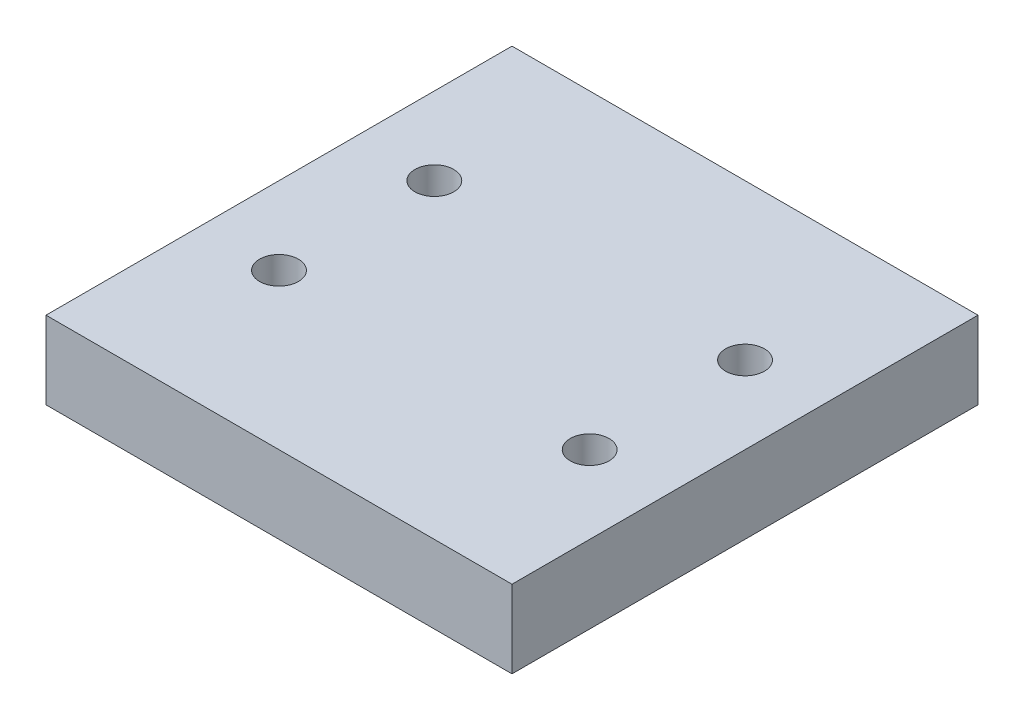
ISO-10303-21;
HEADER;
FILE_DESCRIPTION(('STEP AP214'),'2;1');
FILE_NAME('part.step','',(''),(''),'','','');
FILE_SCHEMA(('AUTOMOTIVE_DESIGN { 1 0 10303 214 1 1 1 1 }'));
ENDSEC;
DATA;
#1=APPLICATION_CONTEXT('core data for automotive mechanical design processes');
#2=APPLICATION_PROTOCOL_DEFINITION('international standard','automotive_design',2000,#1);
#3=PRODUCT_CONTEXT('',#1,'mechanical');
#4=PRODUCT('Part','Part','',(#3));
#5=PRODUCT_RELATED_PRODUCT_CATEGORY('part','',(#4));
#6=PRODUCT_DEFINITION_FORMATION('','',#4);
#7=PRODUCT_DEFINITION_CONTEXT('part definition',#1,'design');
#8=PRODUCT_DEFINITION('design','',#6,#7);
#9=PRODUCT_DEFINITION_SHAPE('','',#8);
#10=(LENGTH_UNIT() NAMED_UNIT(*) SI_UNIT(.MILLI.,.METRE.));
#11=(NAMED_UNIT(*) PLANE_ANGLE_UNIT() SI_UNIT($,.RADIAN.));
#12=(NAMED_UNIT(*) SI_UNIT($,.STERADIAN.) SOLID_ANGLE_UNIT());
#13=UNCERTAINTY_MEASURE_WITH_UNIT(LENGTH_MEASURE(1.E-05),#10,'distance_accuracy_value','');
#14=(GEOMETRIC_REPRESENTATION_CONTEXT(3) GLOBAL_UNCERTAINTY_ASSIGNED_CONTEXT((#13)) GLOBAL_UNIT_ASSIGNED_CONTEXT((#10,
#11,#12)) REPRESENTATION_CONTEXT('',''));
#15=CARTESIAN_POINT('',(0.,0.,0.));
#16=DIRECTION('',(0.,0.,1.));
#17=DIRECTION('',(1.,0.,0.));
#18=AXIS2_PLACEMENT_3D('',#15,#16,#17);
#19=CARTESIAN_POINT('',(-479.999999999999,30.,-1193.6));
#20=DIRECTION('',(0.,1.,0.));
#21=DIRECTION('',(0.,0.,1.));
#22=AXIS2_PLACEMENT_3D('',#19,#20,#21);
#23=PLANE('',#22);
#24=CARTESIAN_POINT('',(-489.999999999999,30.,-1180.));
#25=DIRECTION('',(0.,1.,0.));
#26=DIRECTION('',(0.,0.,1.));
#27=AXIS2_PLACEMENT_3D('',#24,#25,#26);
#28=CIRCLE('',#27,2.49999999999995);
#29=CARTESIAN_POINT('',(-489.999999999999,30.,-1177.5));
#30=VERTEX_POINT('',#29);
#31=EDGE_CURVE('E274',#30,#30,#28,.F.);
#32=ORIENTED_EDGE('',*,*,#31,.F.);
#33=EDGE_LOOP('',(#32));
#34=FACE_BOUND('',#33,.T.);
#35=CARTESIAN_POINT('',(-529.999999999999,30.,-1160.));
#36=DIRECTION('',(0.,1.,0.));
#37=DIRECTION('',(0.,0.,1.));
#38=AXIS2_PLACEMENT_3D('',#35,#36,#37);
#39=CIRCLE('',#38,2.49999999999995);
#40=CARTESIAN_POINT('',(-529.999999999999,30.,-1157.5));
#41=VERTEX_POINT('',#40);
#42=EDGE_CURVE('E74',#41,#41,#39,.F.);
#43=ORIENTED_EDGE('',*,*,#42,.F.);
#44=EDGE_LOOP('',(#43));
#45=FACE_BOUND('',#44,.T.);
#46=DIRECTION('',(0.,0.,1.));
#47=VECTOR('',#46,1.);
#48=CARTESIAN_POINT('',(-539.999999999999,30.,0.));
#49=LINE('',#48,#47);
#50=CARTESIAN_POINT('',(-539.999999999999,30.,-1200.));
#51=VERTEX_POINT('',#50);
#52=CARTESIAN_POINT('',(-539.999999999999,30.,-1140.));
#53=VERTEX_POINT('',#52);
#54=EDGE_CURVE('E19',#51,#53,#49,.T.);
#55=ORIENTED_EDGE('',*,*,#54,.F.);
#56=DIRECTION('',(1.,0.,0.));
#57=VECTOR('',#56,1.);
#58=CARTESIAN_POINT('',(0.,30.,-1200.));
#59=LINE('',#58,#57);
#60=CARTESIAN_POINT('',(-479.999999999999,30.,-1200.));
#61=VERTEX_POINT('',#60);
#62=EDGE_CURVE('E56',#61,#51,#59,.F.);
#63=ORIENTED_EDGE('',*,*,#62,.F.);
#64=DIRECTION('',(0.,0.,1.));
#65=VECTOR('',#64,1.);
#66=CARTESIAN_POINT('',(-479.999999999999,30.,0.));
#67=LINE('',#66,#65);
#68=CARTESIAN_POINT('',(-479.999999999999,30.,-1140.));
#69=VERTEX_POINT('',#68);
#70=EDGE_CURVE('E73',#69,#61,#67,.F.);
#71=ORIENTED_EDGE('',*,*,#70,.F.);
#72=DIRECTION('',(1.,0.,0.));
#73=VECTOR('',#72,1.);
#74=CARTESIAN_POINT('',(0.,30.,-1140.));
#75=LINE('',#74,#73);
#76=EDGE_CURVE('E57',#53,#69,#75,.T.);
#77=ORIENTED_EDGE('',*,*,#76,.F.);
#78=EDGE_LOOP('',(#55,#63,#71,#77));
#79=FACE_BOUND('',#78,.T.);
#80=CARTESIAN_POINT('',(-529.999999999999,30.,-1180.));
#81=DIRECTION('',(0.,1.,0.));
#82=DIRECTION('',(0.,0.,1.));
#83=AXIS2_PLACEMENT_3D('',#80,#81,#82);
#84=CIRCLE('',#83,2.49999999999995);
#85=CARTESIAN_POINT('',(-529.999999999999,30.,-1177.5));
#86=VERTEX_POINT('',#85);
#87=EDGE_CURVE('E277',#86,#86,#84,.F.);
#88=ORIENTED_EDGE('',*,*,#87,.F.);
#89=EDGE_LOOP('',(#88));
#90=FACE_BOUND('',#89,.T.);
#91=CARTESIAN_POINT('',(-489.999999999999,30.,-1160.));
#92=DIRECTION('',(0.,1.,0.));
#93=DIRECTION('',(0.,0.,1.));
#94=AXIS2_PLACEMENT_3D('',#91,#92,#93);
#95=CIRCLE('',#94,2.49999999999995);
#96=CARTESIAN_POINT('',(-489.999999999999,30.,-1157.5));
#97=VERTEX_POINT('',#96);
#98=EDGE_CURVE('E272',#97,#97,#95,.F.);
#99=ORIENTED_EDGE('',*,*,#98,.F.);
#100=EDGE_LOOP('',(#99));
#101=FACE_BOUND('',#100,.T.);
#102=ADVANCED_FACE('F16',(#34,#45,#79,#90,#101),#23,.F.);
#103=CARTESIAN_POINT('',(-539.999999999999,40.,-1200.));
#104=DIRECTION('',(0.,0.,1.));
#105=DIRECTION('',(1.,0.,0.));
#106=AXIS2_PLACEMENT_3D('',#103,#104,#105);
#107=PLANE('',#106);
#108=DIRECTION('',(0.,1.,0.));
#109=VECTOR('',#108,1.);
#110=CARTESIAN_POINT('',(-539.999999999999,40.,-1200.));
#111=LINE('',#110,#109);
#112=CARTESIAN_POINT('',(-539.999999999999,40.,-1200.));
#113=VERTEX_POINT('',#112);
#114=EDGE_CURVE('E68',#51,#113,#111,.T.);
#115=ORIENTED_EDGE('',*,*,#114,.T.);
#116=DIRECTION('',(1.,0.,0.));
#117=VECTOR('',#116,1.);
#118=CARTESIAN_POINT('',(-539.999999999999,40.,-1200.));
#119=LINE('',#118,#117);
#120=CARTESIAN_POINT('',(-479.999999999999,40.,-1200.));
#121=VERTEX_POINT('',#120);
#122=EDGE_CURVE('E26',#121,#113,#119,.F.);
#123=ORIENTED_EDGE('',*,*,#122,.F.);
#124=DIRECTION('',(0.,1.,0.));
#125=VECTOR('',#124,1.);
#126=CARTESIAN_POINT('',(-479.999999999999,40.,-1200.));
#127=LINE('',#126,#125);
#128=EDGE_CURVE('E71',#121,#61,#127,.F.);
#129=ORIENTED_EDGE('',*,*,#128,.T.);
#130=ORIENTED_EDGE('',*,*,#62,.T.);
#131=EDGE_LOOP('',(#115,#123,#129,#130));
#132=FACE_BOUND('',#131,.T.);
#133=ADVANCED_FACE('F66',(#132),#107,.F.);
#134=CARTESIAN_POINT('',(0.,40.,0.));
#135=DIRECTION('',(0.,1.,0.));
#136=DIRECTION('',(0.,0.,1.));
#137=AXIS2_PLACEMENT_3D('',#134,#135,#136);
#138=PLANE('',#137);
#139=DIRECTION('',(0.,0.,1.));
#140=VECTOR('',#139,1.);
#141=CARTESIAN_POINT('',(-479.999999999999,40.,-1140.));
#142=LINE('',#141,#140);
#143=CARTESIAN_POINT('',(-479.999999999999,40.,-1140.));
#144=VERTEX_POINT('',#143);
#145=EDGE_CURVE('E83',#144,#121,#142,.F.);
#146=ORIENTED_EDGE('',*,*,#145,.T.);
#147=ORIENTED_EDGE('',*,*,#122,.T.);
#148=DIRECTION('',(0.,0.,-1.));
#149=VECTOR('',#148,1.);
#150=CARTESIAN_POINT('',(-539.999999999999,40.,-1140.));
#151=LINE('',#150,#149);
#152=CARTESIAN_POINT('',(-539.999999999999,40.,-1140.));
#153=VERTEX_POINT('',#152);
#154=EDGE_CURVE('E77',#113,#153,#151,.F.);
#155=ORIENTED_EDGE('',*,*,#154,.T.);
#156=DIRECTION('',(-1.,0.,0.));
#157=VECTOR('',#156,1.);
#158=CARTESIAN_POINT('',(-539.999999999999,40.,-1140.));
#159=LINE('',#158,#157);
#160=EDGE_CURVE('E11',#153,#144,#159,.F.);
#161=ORIENTED_EDGE('',*,*,#160,.T.);
#162=EDGE_LOOP('',(#146,#147,#155,#161));
#163=FACE_BOUND('',#162,.T.);
#164=CARTESIAN_POINT('',(-529.999999999999,40.,-1160.));
#165=DIRECTION('',(0.,1.,0.));
#166=DIRECTION('',(0.,0.,1.));
#167=AXIS2_PLACEMENT_3D('',#164,#165,#166);
#168=CIRCLE('',#167,2.49999999999995);
#169=CARTESIAN_POINT('',(-529.999999999999,40.,-1157.5));
#170=VERTEX_POINT('',#169);
#171=EDGE_CURVE('E62',#170,#170,#168,.F.);
#172=ORIENTED_EDGE('',*,*,#171,.T.);
#173=EDGE_LOOP('',(#172));
#174=FACE_BOUND('',#173,.T.);
#175=CARTESIAN_POINT('',(-529.999999999999,40.,-1180.));
#176=DIRECTION('',(0.,1.,0.));
#177=DIRECTION('',(0.,0.,1.));
#178=AXIS2_PLACEMENT_3D('',#175,#176,#177);
#179=CIRCLE('',#178,2.49999999999995);
#180=CARTESIAN_POINT('',(-529.999999999999,40.,-1177.5));
#181=VERTEX_POINT('',#180);
#182=EDGE_CURVE('E141',#181,#181,#179,.F.);
#183=ORIENTED_EDGE('',*,*,#182,.T.);
#184=EDGE_LOOP('',(#183));
#185=FACE_BOUND('',#184,.T.);
#186=CARTESIAN_POINT('',(-489.999999999999,40.,-1180.));
#187=DIRECTION('',(0.,1.,0.));
#188=DIRECTION('',(0.,0.,1.));
#189=AXIS2_PLACEMENT_3D('',#186,#187,#188);
#190=CIRCLE('',#189,2.49999999999995);
#191=CARTESIAN_POINT('',(-489.999999999999,40.,-1177.5));
#192=VERTEX_POINT('',#191);
#193=EDGE_CURVE('E135',#192,#192,#190,.F.);
#194=ORIENTED_EDGE('',*,*,#193,.T.);
#195=EDGE_LOOP('',(#194));
#196=FACE_BOUND('',#195,.T.);
#197=CARTESIAN_POINT('',(-489.999999999999,40.,-1160.));
#198=DIRECTION('',(0.,1.,0.));
#199=DIRECTION('',(0.,0.,1.));
#200=AXIS2_PLACEMENT_3D('',#197,#198,#199);
#201=CIRCLE('',#200,2.49999999999995);
#202=CARTESIAN_POINT('',(-489.999999999999,40.,-1157.5));
#203=VERTEX_POINT('',#202);
#204=EDGE_CURVE('E132',#203,#203,#201,.F.);
#205=ORIENTED_EDGE('',*,*,#204,.T.);
#206=EDGE_LOOP('',(#205));
#207=FACE_BOUND('',#206,.T.);
#208=ADVANCED_FACE('F152',(#163,#174,#185,#196,#207),#138,.T.);
#209=CARTESIAN_POINT('',(-539.999999999999,40.,-1140.));
#210=DIRECTION('',(0.,0.,-1.));
#211=DIRECTION('',(-1.,0.,0.));
#212=AXIS2_PLACEMENT_3D('',#209,#210,#211);
#213=PLANE('',#212);
#214=DIRECTION('',(0.,1.,0.));
#215=VECTOR('',#214,1.);
#216=CARTESIAN_POINT('',(-479.999999999999,40.,-1140.));
#217=LINE('',#216,#215);
#218=EDGE_CURVE('E113',#69,#144,#217,.T.);
#219=ORIENTED_EDGE('',*,*,#218,.T.);
#220=ORIENTED_EDGE('',*,*,#160,.F.);
#221=DIRECTION('',(0.,1.,0.));
#222=VECTOR('',#221,1.);
#223=CARTESIAN_POINT('',(-539.999999999999,40.,-1140.));
#224=LINE('',#223,#222);
#225=EDGE_CURVE('E85',#153,#53,#224,.F.);
#226=ORIENTED_EDGE('',*,*,#225,.T.);
#227=ORIENTED_EDGE('',*,*,#76,.T.);
#228=EDGE_LOOP('',(#219,#220,#226,#227));
#229=FACE_BOUND('',#228,.T.);
#230=ADVANCED_FACE('F191',(#229),#213,.F.);
#231=CARTESIAN_POINT('',(-539.999999999999,40.,-1140.));
#232=DIRECTION('',(1.,0.,0.));
#233=DIRECTION('',(0.,0.,-1.));
#234=AXIS2_PLACEMENT_3D('',#231,#232,#233);
#235=PLANE('',#234);
#236=ORIENTED_EDGE('',*,*,#225,.F.);
#237=ORIENTED_EDGE('',*,*,#154,.F.);
#238=ORIENTED_EDGE('',*,*,#114,.F.);
#239=ORIENTED_EDGE('',*,*,#54,.T.);
#240=EDGE_LOOP('',(#236,#237,#238,#239));
#241=FACE_BOUND('',#240,.T.);
#242=ADVANCED_FACE('F76',(#241),#235,.F.);
#243=CARTESIAN_POINT('',(-479.999999999999,40.,-1140.));
#244=DIRECTION('',(-1.,0.,0.));
#245=DIRECTION('',(0.,0.,1.));
#246=AXIS2_PLACEMENT_3D('',#243,#244,#245);
#247=PLANE('',#246);
#248=ORIENTED_EDGE('',*,*,#128,.F.);
#249=ORIENTED_EDGE('',*,*,#145,.F.);
#250=ORIENTED_EDGE('',*,*,#218,.F.);
#251=ORIENTED_EDGE('',*,*,#70,.T.);
#252=EDGE_LOOP('',(#248,#249,#250,#251));
#253=FACE_BOUND('',#252,.T.);
#254=ADVANCED_FACE('F158',(#253),#247,.F.);
#255=CARTESIAN_POINT('',(-529.999999999999,40.,-1160.));
#256=DIRECTION('',(0.,1.,0.));
#257=DIRECTION('',(0.,0.,1.));
#258=AXIS2_PLACEMENT_3D('',#255,#256,#257);
#259=CYLINDRICAL_SURFACE('',#258,2.49999999999995);
#260=ORIENTED_EDGE('',*,*,#42,.T.);
#261=EDGE_LOOP('',(#260));
#262=FACE_BOUND('',#261,.T.);
#263=ORIENTED_EDGE('',*,*,#171,.F.);
#264=EDGE_LOOP('',(#263));
#265=FACE_BOUND('',#264,.T.);
#266=ADVANCED_FACE('F155',(#262,#265),#259,.F.);
#267=CARTESIAN_POINT('',(-529.999999999999,40.,-1180.));
#268=DIRECTION('',(0.,1.,0.));
#269=DIRECTION('',(0.,0.,1.));
#270=AXIS2_PLACEMENT_3D('',#267,#268,#269);
#271=CYLINDRICAL_SURFACE('',#270,2.49999999999995);
#272=ORIENTED_EDGE('',*,*,#87,.T.);
#273=EDGE_LOOP('',(#272));
#274=FACE_BOUND('',#273,.T.);
#275=ORIENTED_EDGE('',*,*,#182,.F.);
#276=EDGE_LOOP('',(#275));
#277=FACE_BOUND('',#276,.T.);
#278=ADVANCED_FACE('F157',(#274,#277),#271,.F.);
#279=CARTESIAN_POINT('',(-489.999999999999,40.,-1180.));
#280=DIRECTION('',(0.,1.,0.));
#281=DIRECTION('',(0.,0.,1.));
#282=AXIS2_PLACEMENT_3D('',#279,#280,#281);
#283=CYLINDRICAL_SURFACE('',#282,2.49999999999995);
#284=ORIENTED_EDGE('',*,*,#31,.T.);
#285=EDGE_LOOP('',(#284));
#286=FACE_BOUND('',#285,.T.);
#287=ORIENTED_EDGE('',*,*,#193,.F.);
#288=EDGE_LOOP('',(#287));
#289=FACE_BOUND('',#288,.T.);
#290=ADVANCED_FACE('F165',(#286,#289),#283,.F.);
#291=CARTESIAN_POINT('',(-489.999999999999,40.,-1160.));
#292=DIRECTION('',(0.,1.,0.));
#293=DIRECTION('',(0.,0.,1.));
#294=AXIS2_PLACEMENT_3D('',#291,#292,#293);
#295=CYLINDRICAL_SURFACE('',#294,2.49999999999995);
#296=ORIENTED_EDGE('',*,*,#98,.T.);
#297=EDGE_LOOP('',(#296));
#298=FACE_BOUND('',#297,.T.);
#299=ORIENTED_EDGE('',*,*,#204,.F.);
#300=EDGE_LOOP('',(#299));
#301=FACE_BOUND('',#300,.T.);
#302=ADVANCED_FACE('F172',(#298,#301),#295,.F.);
#303=CLOSED_SHELL('',(#102,#133,#208,#230,#242,#254,#266,#278,#290,#302));
#304=MANIFOLD_SOLID_BREP('B1',#303);
#305=ADVANCED_BREP_SHAPE_REPRESENTATION('',(#18,#304),#14);
#306=SHAPE_DEFINITION_REPRESENTATION(#9,#305);
ENDSEC;
END-ISO-10303-21;
